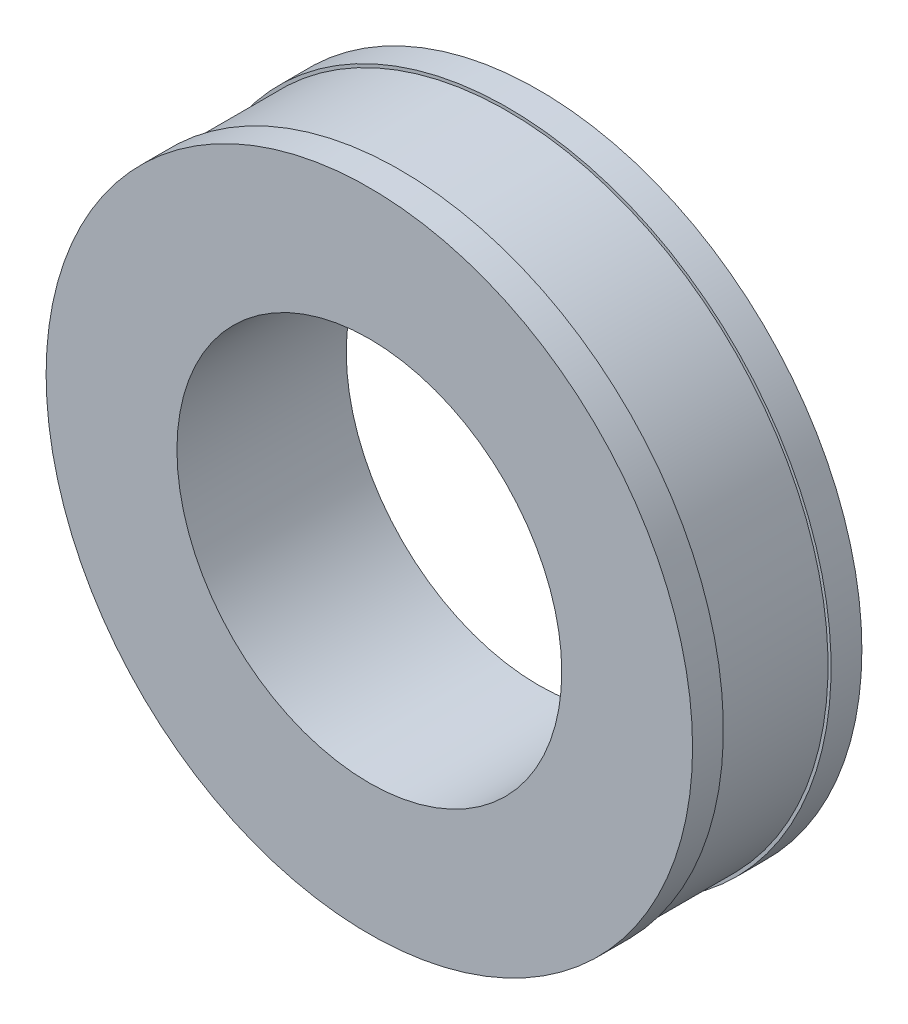
ISO-10303-21;
HEADER;
FILE_DESCRIPTION(('STEP AP214'),'2;1');
FILE_NAME('part.step','',(''),(''),'','','');
FILE_SCHEMA(('AUTOMOTIVE_DESIGN { 1 0 10303 214 1 1 1 1 }'));
ENDSEC;
DATA;
#1=APPLICATION_CONTEXT('core data for automotive mechanical design processes');
#2=APPLICATION_PROTOCOL_DEFINITION('international standard','automotive_design',2000,#1);
#3=PRODUCT_CONTEXT('',#1,'mechanical');
#4=PRODUCT('Part','Part','',(#3));
#5=PRODUCT_RELATED_PRODUCT_CATEGORY('part','',(#4));
#6=PRODUCT_DEFINITION_FORMATION('','',#4);
#7=PRODUCT_DEFINITION_CONTEXT('part definition',#1,'design');
#8=PRODUCT_DEFINITION('design','',#6,#7);
#9=PRODUCT_DEFINITION_SHAPE('','',#8);
#10=(LENGTH_UNIT() NAMED_UNIT(*) SI_UNIT(.MILLI.,.METRE.));
#11=(NAMED_UNIT(*) PLANE_ANGLE_UNIT() SI_UNIT($,.RADIAN.));
#12=(NAMED_UNIT(*) SI_UNIT($,.STERADIAN.) SOLID_ANGLE_UNIT());
#13=UNCERTAINTY_MEASURE_WITH_UNIT(LENGTH_MEASURE(1.E-05),#10,'distance_accuracy_value','');
#14=(GEOMETRIC_REPRESENTATION_CONTEXT(3) GLOBAL_UNCERTAINTY_ASSIGNED_CONTEXT((#13)) GLOBAL_UNIT_ASSIGNED_CONTEXT((#10,
#11,#12)) REPRESENTATION_CONTEXT('',''));
#15=CARTESIAN_POINT('',(0.,0.,0.));
#16=DIRECTION('',(0.,0.,1.));
#17=DIRECTION('',(1.,0.,0.));
#18=AXIS2_PLACEMENT_3D('',#15,#16,#17);
#19=CARTESIAN_POINT('',(0.,0.,11.));
#20=DIRECTION('',(0.,0.,-1.));
#21=DIRECTION('',(-1.,0.,0.));
#22=AXIS2_PLACEMENT_3D('',#19,#20,#21);
#23=CYLINDRICAL_SURFACE('',#22,21.);
#24=CARTESIAN_POINT('',(0.,0.,9.00000000000001));
#25=DIRECTION('',(0.,0.,-1.));
#26=DIRECTION('',(-1.,0.,0.));
#27=AXIS2_PLACEMENT_3D('',#24,#25,#26);
#28=CIRCLE('',#27,21.);
#29=CARTESIAN_POINT('',(-21.,0.,9.));
#30=VERTEX_POINT('',#29);
#31=EDGE_CURVE('E56',#30,#30,#28,.T.);
#32=ORIENTED_EDGE('',*,*,#31,.F.);
#33=EDGE_LOOP('',(#32));
#34=FACE_BOUND('',#33,.T.);
#35=CARTESIAN_POINT('',(0.,0.,11.));
#36=DIRECTION('',(0.,0.,1.));
#37=DIRECTION('',(1.,0.,0.));
#38=AXIS2_PLACEMENT_3D('',#35,#36,#37);
#39=CIRCLE('',#38,21.);
#40=CARTESIAN_POINT('',(21.,0.,11.));
#41=VERTEX_POINT('',#40);
#42=EDGE_CURVE('E10',#41,#41,#39,.T.);
#43=ORIENTED_EDGE('',*,*,#42,.F.);
#44=EDGE_LOOP('',(#43));
#45=FACE_BOUND('',#44,.T.);
#46=ADVANCED_FACE('F37',(#34,#45),#23,.T.);
#47=CARTESIAN_POINT('',(0.,0.,11.));
#48=DIRECTION('',(0.,0.,1.));
#49=DIRECTION('',(1.,0.,0.));
#50=AXIS2_PLACEMENT_3D('',#47,#48,#49);
#51=PLANE('',#50);
#52=ORIENTED_EDGE('',*,*,#42,.T.);
#53=EDGE_LOOP('',(#52));
#54=FACE_BOUND('',#53,.T.);
#55=CARTESIAN_POINT('',(0.,0.,11.));
#56=DIRECTION('',(0.,0.,1.));
#57=DIRECTION('',(1.,0.,0.));
#58=AXIS2_PLACEMENT_3D('',#55,#56,#57);
#59=CIRCLE('',#58,12.5);
#60=CARTESIAN_POINT('',(12.5,0.,11.));
#61=VERTEX_POINT('',#60);
#62=EDGE_CURVE('E50',#61,#61,#59,.T.);
#63=ORIENTED_EDGE('',*,*,#62,.F.);
#64=EDGE_LOOP('',(#63));
#65=FACE_BOUND('',#64,.T.);
#66=ADVANCED_FACE('F99',(#54,#65),#51,.T.);
#67=CARTESIAN_POINT('',(0.,0.,0.));
#68=DIRECTION('',(0.,0.,1.));
#69=DIRECTION('',(1.,0.,0.));
#70=AXIS2_PLACEMENT_3D('',#67,#68,#69);
#71=PLANE('',#70);
#72=CARTESIAN_POINT('',(0.,0.,0.));
#73=DIRECTION('',(0.,0.,1.));
#74=DIRECTION('',(1.,0.,0.));
#75=AXIS2_PLACEMENT_3D('',#72,#73,#74);
#76=CIRCLE('',#75,21.);
#77=CARTESIAN_POINT('',(21.,0.,0.));
#78=VERTEX_POINT('',#77);
#79=EDGE_CURVE('E41',#78,#78,#76,.T.);
#80=ORIENTED_EDGE('',*,*,#79,.F.);
#81=EDGE_LOOP('',(#80));
#82=FACE_BOUND('',#81,.T.);
#83=CARTESIAN_POINT('',(0.,0.,0.));
#84=DIRECTION('',(0.,0.,1.));
#85=DIRECTION('',(1.,0.,0.));
#86=AXIS2_PLACEMENT_3D('',#83,#84,#85);
#87=CIRCLE('',#86,12.5);
#88=CARTESIAN_POINT('',(12.5,0.,0.));
#89=VERTEX_POINT('',#88);
#90=EDGE_CURVE('E52',#89,#89,#87,.T.);
#91=ORIENTED_EDGE('',*,*,#90,.T.);
#92=EDGE_LOOP('',(#91));
#93=FACE_BOUND('',#92,.T.);
#94=ADVANCED_FACE('F103',(#82,#93),#71,.F.);
#95=CARTESIAN_POINT('',(0.,0.,2.00000000000001));
#96=DIRECTION('',(0.,0.,-1.));
#97=DIRECTION('',(-1.,0.,0.));
#98=AXIS2_PLACEMENT_3D('',#95,#96,#97);
#99=CIRCLE('',#98,21.);
#100=CARTESIAN_POINT('',(-21.,0.,2.));
#101=VERTEX_POINT('',#100);
#102=EDGE_CURVE('E71',#101,#101,#99,.T.);
#103=ORIENTED_EDGE('',*,*,#102,.T.);
#104=EDGE_LOOP('',(#103));
#105=FACE_BOUND('',#104,.T.);
#106=ORIENTED_EDGE('',*,*,#79,.T.);
#107=EDGE_LOOP('',(#106));
#108=FACE_BOUND('',#107,.T.);
#109=ADVANCED_FACE('F39',(#105,#108),#23,.T.);
#110=CARTESIAN_POINT('',(0.,0.,11.));
#111=DIRECTION('',(0.,0.,-1.));
#112=DIRECTION('',(-1.,0.,0.));
#113=AXIS2_PLACEMENT_3D('',#110,#111,#112);
#114=CYLINDRICAL_SURFACE('',#113,12.5);
#115=ORIENTED_EDGE('',*,*,#62,.T.);
#116=EDGE_LOOP('',(#115));
#117=FACE_BOUND('',#116,.T.);
#118=ORIENTED_EDGE('',*,*,#90,.F.);
#119=EDGE_LOOP('',(#118));
#120=FACE_BOUND('',#119,.T.);
#121=ADVANCED_FACE('F93',(#117,#120),#114,.F.);
#122=CARTESIAN_POINT('',(-21.,0.,9.));
#123=DIRECTION('',(0.,0.,1.));
#124=DIRECTION('',(1.,0.,0.));
#125=AXIS2_PLACEMENT_3D('',#122,#123,#124);
#126=PLANE('',#125);
#127=CARTESIAN_POINT('',(0.,0.,9.00000000000001));
#128=DIRECTION('',(0.,0.,-1.));
#129=DIRECTION('',(-1.,0.,0.));
#130=AXIS2_PLACEMENT_3D('',#127,#128,#129);
#131=CIRCLE('',#130,20.8);
#132=CARTESIAN_POINT('',(-20.8,0.,9.));
#133=VERTEX_POINT('',#132);
#134=EDGE_CURVE('E63',#133,#133,#131,.T.);
#135=ORIENTED_EDGE('',*,*,#134,.F.);
#136=EDGE_LOOP('',(#135));
#137=FACE_BOUND('',#136,.T.);
#138=ORIENTED_EDGE('',*,*,#31,.T.);
#139=EDGE_LOOP('',(#138));
#140=FACE_BOUND('',#139,.T.);
#141=ADVANCED_FACE('F87',(#137,#140),#126,.F.);
#142=CARTESIAN_POINT('',(0.,0.,0.));
#143=DIRECTION('',(0.,0.,-1.));
#144=DIRECTION('',(-1.,0.,0.));
#145=AXIS2_PLACEMENT_3D('',#142,#143,#144);
#146=CYLINDRICAL_SURFACE('',#145,20.8);
#147=CARTESIAN_POINT('',(0.,0.,2.00000000000001));
#148=DIRECTION('',(0.,0.,-1.));
#149=DIRECTION('',(-1.,0.,0.));
#150=AXIS2_PLACEMENT_3D('',#147,#148,#149);
#151=CIRCLE('',#150,20.8);
#152=CARTESIAN_POINT('',(-20.8,0.,2.));
#153=VERTEX_POINT('',#152);
#154=EDGE_CURVE('E67',#153,#153,#151,.T.);
#155=ORIENTED_EDGE('',*,*,#154,.F.);
#156=EDGE_LOOP('',(#155));
#157=FACE_BOUND('',#156,.T.);
#158=ORIENTED_EDGE('',*,*,#134,.T.);
#159=EDGE_LOOP('',(#158));
#160=FACE_BOUND('',#159,.T.);
#161=ADVANCED_FACE('F81',(#157,#160),#146,.T.);
#162=CARTESIAN_POINT('',(-21.,0.,2.));
#163=DIRECTION('',(0.,0.,-1.));
#164=DIRECTION('',(-1.,0.,0.));
#165=AXIS2_PLACEMENT_3D('',#162,#163,#164);
#166=PLANE('',#165);
#167=ORIENTED_EDGE('',*,*,#102,.F.);
#168=EDGE_LOOP('',(#167));
#169=FACE_BOUND('',#168,.T.);
#170=ORIENTED_EDGE('',*,*,#154,.T.);
#171=EDGE_LOOP('',(#170));
#172=FACE_BOUND('',#171,.T.);
#173=ADVANCED_FACE('F78',(#169,#172),#166,.F.);
#174=CLOSED_SHELL('',(#46,#66,#94,#109,#121,#141,#161,#173));
#175=MANIFOLD_SOLID_BREP('B2',#174);
#176=ADVANCED_BREP_SHAPE_REPRESENTATION('',(#18,#175),#14);
#177=SHAPE_DEFINITION_REPRESENTATION(#9,#176);
ENDSEC;
END-ISO-10303-21;
